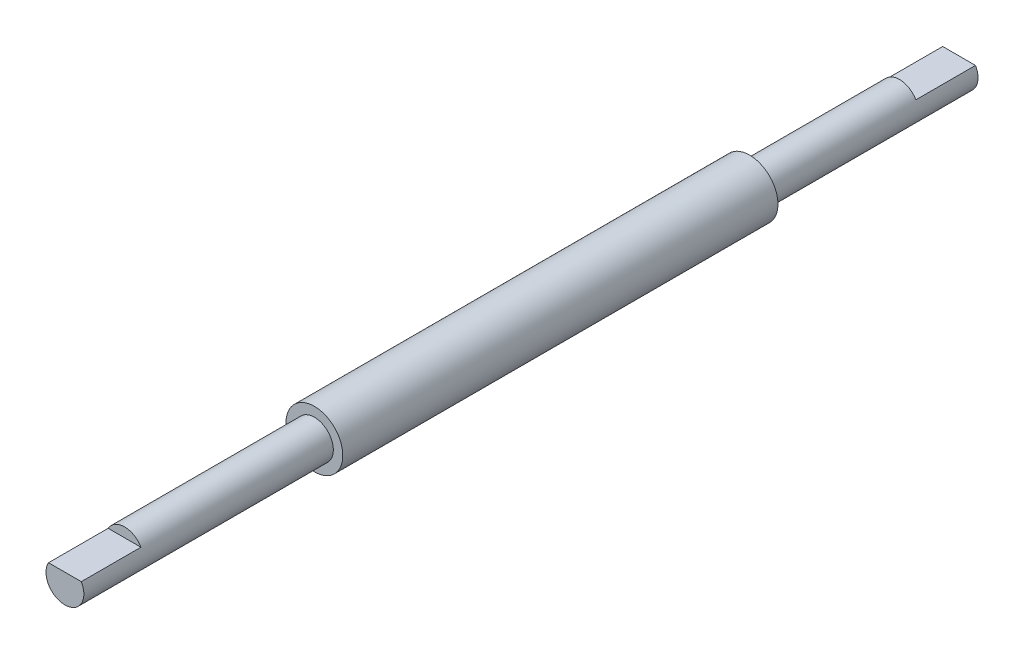
ISO-10303-21;
HEADER;
FILE_DESCRIPTION(('STEP AP214'),'2;1');
FILE_NAME('part.step','',(''),(''),'','','');
FILE_SCHEMA(('AUTOMOTIVE_DESIGN { 1 0 10303 214 1 1 1 1 }'));
ENDSEC;
DATA;
#1=APPLICATION_CONTEXT('core data for automotive mechanical design processes');
#2=APPLICATION_PROTOCOL_DEFINITION('international standard','automotive_design',2000,#1);
#3=PRODUCT_CONTEXT('',#1,'mechanical');
#4=PRODUCT('Part','Part','',(#3));
#5=PRODUCT_RELATED_PRODUCT_CATEGORY('part','',(#4));
#6=PRODUCT_DEFINITION_FORMATION('','',#4);
#7=PRODUCT_DEFINITION_CONTEXT('part definition',#1,'design');
#8=PRODUCT_DEFINITION('design','',#6,#7);
#9=PRODUCT_DEFINITION_SHAPE('','',#8);
#10=(LENGTH_UNIT() NAMED_UNIT(*) SI_UNIT(.MILLI.,.METRE.));
#11=(NAMED_UNIT(*) PLANE_ANGLE_UNIT() SI_UNIT($,.RADIAN.));
#12=(NAMED_UNIT(*) SI_UNIT($,.STERADIAN.) SOLID_ANGLE_UNIT());
#13=UNCERTAINTY_MEASURE_WITH_UNIT(LENGTH_MEASURE(1.E-05),#10,'distance_accuracy_value','');
#14=(GEOMETRIC_REPRESENTATION_CONTEXT(3) GLOBAL_UNCERTAINTY_ASSIGNED_CONTEXT((#13)) GLOBAL_UNIT_ASSIGNED_CONTEXT((#10,
#11,#12)) REPRESENTATION_CONTEXT('',''));
#15=CARTESIAN_POINT('',(0.,0.,0.));
#16=DIRECTION('',(0.,0.,1.));
#17=DIRECTION('',(1.,0.,0.));
#18=AXIS2_PLACEMENT_3D('',#15,#16,#17);
#19=CARTESIAN_POINT('',(0.,0.,300.));
#20=DIRECTION('',(0.,0.,-1.));
#21=DIRECTION('',(-1.,0.,0.));
#22=AXIS2_PLACEMENT_3D('',#19,#20,#21);
#23=CYLINDRICAL_SURFACE('',#22,6.35);
#24=CARTESIAN_POINT('',(0.,0.,216.2975));
#25=DIRECTION('',(0.,0.,-1.));
#26=DIRECTION('',(-1.,0.,0.));
#27=AXIS2_PLACEMENT_3D('',#24,#25,#26);
#28=CIRCLE('',#27,6.35);
#29=CARTESIAN_POINT('',(-6.35,0.,216.2975));
#30=VERTEX_POINT('',#29);
#31=EDGE_CURVE('E11',#30,#30,#28,.T.);
#32=ORIENTED_EDGE('',*,*,#31,.F.);
#33=EDGE_LOOP('',(#32));
#34=FACE_BOUND('',#33,.T.);
#35=DIRECTION('',(0.,0.,1.));
#36=VECTOR('',#35,1.);
#37=CARTESIAN_POINT('',(5.49926131403118,3.175,280.));
#38=LINE('',#37,#36);
#39=CARTESIAN_POINT('',(5.49926131403118,3.175,280.));
#40=VERTEX_POINT('',#39);
#41=CARTESIAN_POINT('',(5.49926131403118,3.175,300.));
#42=VERTEX_POINT('',#41);
#43=EDGE_CURVE('E81',#40,#42,#38,.T.);
#44=ORIENTED_EDGE('',*,*,#43,.T.);
#45=CARTESIAN_POINT('',(0.,0.,300.));
#46=DIRECTION('',(0.,0.,1.));
#47=DIRECTION('',(1.,0.,0.));
#48=AXIS2_PLACEMENT_3D('',#45,#46,#47);
#49=CIRCLE('',#48,6.35);
#50=CARTESIAN_POINT('',(-5.49926131403118,3.175,300.));
#51=VERTEX_POINT('',#50);
#52=EDGE_CURVE('E46',#51,#42,#49,.T.);
#53=ORIENTED_EDGE('',*,*,#52,.F.);
#54=DIRECTION('',(0.,0.,1.));
#55=VECTOR('',#54,1.);
#56=CARTESIAN_POINT('',(-5.49926131403119,3.175,280.));
#57=LINE('',#56,#55);
#58=CARTESIAN_POINT('',(-5.49926131403119,3.175,280.));
#59=VERTEX_POINT('',#58);
#60=EDGE_CURVE('E53',#59,#51,#57,.T.);
#61=ORIENTED_EDGE('',*,*,#60,.F.);
#62=CARTESIAN_POINT('',(0.,0.,280.));
#63=DIRECTION('',(0.,0.,1.));
#64=DIRECTION('',(1.,0.,0.));
#65=AXIS2_PLACEMENT_3D('',#62,#63,#64);
#66=CIRCLE('',#65,6.35);
#67=EDGE_CURVE('E84',#40,#59,#66,.T.);
#68=ORIENTED_EDGE('',*,*,#67,.F.);
#69=EDGE_LOOP('',(#44,#53,#61,#68));
#70=FACE_BOUND('',#69,.T.);
#71=ADVANCED_FACE('F38',(#34,#70),#23,.T.);
#72=CARTESIAN_POINT('',(0.,0.,300.));
#73=DIRECTION('',(0.,0.,1.));
#74=DIRECTION('',(1.,0.,0.));
#75=AXIS2_PLACEMENT_3D('',#72,#73,#74);
#76=PLANE('',#75);
#77=ORIENTED_EDGE('',*,*,#52,.T.);
#78=DIRECTION('',(-1.,0.,0.));
#79=VECTOR('',#78,1.);
#80=CARTESIAN_POINT('',(0.,3.175,300.));
#81=LINE('',#80,#79);
#82=EDGE_CURVE('E88',#42,#51,#81,.T.);
#83=ORIENTED_EDGE('',*,*,#82,.T.);
#84=EDGE_LOOP('',(#77,#83));
#85=FACE_BOUND('',#84,.T.);
#86=ADVANCED_FACE('F143',(#85),#76,.T.);
#87=CARTESIAN_POINT('',(0.,0.,0.));
#88=DIRECTION('',(0.,0.,1.));
#89=DIRECTION('',(1.,0.,0.));
#90=AXIS2_PLACEMENT_3D('',#87,#88,#89);
#91=PLANE('',#90);
#92=DIRECTION('',(1.,0.,0.));
#93=VECTOR('',#92,1.);
#94=CARTESIAN_POINT('',(-5.49926131403118,3.175,0.));
#95=LINE('',#94,#93);
#96=CARTESIAN_POINT('',(-5.49926131403118,3.175,0.));
#97=VERTEX_POINT('',#96);
#98=CARTESIAN_POINT('',(5.49926131403118,3.175,0.));
#99=VERTEX_POINT('',#98);
#100=EDGE_CURVE('E93',#97,#99,#95,.T.);
#101=ORIENTED_EDGE('',*,*,#100,.T.);
#102=CARTESIAN_POINT('',(0.,0.,0.));
#103=DIRECTION('',(0.,0.,1.));
#104=DIRECTION('',(1.,0.,0.));
#105=AXIS2_PLACEMENT_3D('',#102,#103,#104);
#106=CIRCLE('',#105,6.35);
#107=EDGE_CURVE('E115',#97,#99,#106,.T.);
#108=ORIENTED_EDGE('',*,*,#107,.F.);
#109=EDGE_LOOP('',(#101,#108));
#110=FACE_BOUND('',#109,.T.);
#111=ADVANCED_FACE('F140',(#110),#91,.F.);
#112=CARTESIAN_POINT('',(0.,0.,70.2975));
#113=DIRECTION('',(0.,0.,-1.));
#114=DIRECTION('',(-1.,0.,0.));
#115=AXIS2_PLACEMENT_3D('',#112,#113,#114);
#116=CIRCLE('',#115,6.35);
#117=CARTESIAN_POINT('',(-6.35,0.,70.2975));
#118=VERTEX_POINT('',#117);
#119=EDGE_CURVE('E111',#118,#118,#116,.T.);
#120=ORIENTED_EDGE('',*,*,#119,.T.);
#121=EDGE_LOOP('',(#120));
#122=FACE_BOUND('',#121,.T.);
#123=DIRECTION('',(0.,0.,-1.));
#124=VECTOR('',#123,1.);
#125=CARTESIAN_POINT('',(5.49926131403118,3.175,20.));
#126=LINE('',#125,#124);
#127=CARTESIAN_POINT('',(5.49926131403118,3.175,20.));
#128=VERTEX_POINT('',#127);
#129=EDGE_CURVE('E102',#128,#99,#126,.T.);
#130=ORIENTED_EDGE('',*,*,#129,.F.);
#131=CARTESIAN_POINT('',(0.,0.,20.));
#132=DIRECTION('',(0.,0.,1.));
#133=DIRECTION('',(1.,0.,0.));
#134=AXIS2_PLACEMENT_3D('',#131,#132,#133);
#135=CIRCLE('',#134,6.35);
#136=CARTESIAN_POINT('',(-5.49926131403118,3.175,20.));
#137=VERTEX_POINT('',#136);
#138=EDGE_CURVE('E97',#128,#137,#135,.T.);
#139=ORIENTED_EDGE('',*,*,#138,.T.);
#140=DIRECTION('',(0.,0.,-1.));
#141=VECTOR('',#140,1.);
#142=CARTESIAN_POINT('',(-5.49926131403118,3.175,20.));
#143=LINE('',#142,#141);
#144=EDGE_CURVE('E61',#137,#97,#143,.T.);
#145=ORIENTED_EDGE('',*,*,#144,.T.);
#146=ORIENTED_EDGE('',*,*,#107,.T.);
#147=EDGE_LOOP('',(#130,#139,#145,#146));
#148=FACE_BOUND('',#147,.T.);
#149=ADVANCED_FACE('F40',(#122,#148),#23,.T.);
#150=CARTESIAN_POINT('',(0.,0.,216.2975));
#151=DIRECTION('',(0.,0.,-1.));
#152=DIRECTION('',(-1.,0.,0.));
#153=AXIS2_PLACEMENT_3D('',#150,#151,#152);
#154=CYLINDRICAL_SURFACE('',#153,9.525);
#155=CARTESIAN_POINT('',(0.,0.,216.2975));
#156=DIRECTION('',(0.,0.,-1.));
#157=DIRECTION('',(-1.,0.,0.));
#158=AXIS2_PLACEMENT_3D('',#155,#156,#157);
#159=CIRCLE('',#158,9.525);
#160=CARTESIAN_POINT('',(-9.525,0.,216.2975));
#161=VERTEX_POINT('',#160);
#162=EDGE_CURVE('E108',#161,#161,#159,.T.);
#163=ORIENTED_EDGE('',*,*,#162,.T.);
#164=EDGE_LOOP('',(#163));
#165=FACE_BOUND('',#164,.T.);
#166=CARTESIAN_POINT('',(0.,0.,70.2975));
#167=DIRECTION('',(0.,0.,-1.));
#168=DIRECTION('',(-1.,0.,0.));
#169=AXIS2_PLACEMENT_3D('',#166,#167,#168);
#170=CIRCLE('',#169,9.525);
#171=CARTESIAN_POINT('',(-9.525,0.,70.2975));
#172=VERTEX_POINT('',#171);
#173=EDGE_CURVE('E107',#172,#172,#170,.T.);
#174=ORIENTED_EDGE('',*,*,#173,.F.);
#175=EDGE_LOOP('',(#174));
#176=FACE_BOUND('',#175,.T.);
#177=ADVANCED_FACE('F130',(#165,#176),#154,.T.);
#178=CARTESIAN_POINT('',(0.,0.,216.2975));
#179=DIRECTION('',(0.,0.,-1.));
#180=DIRECTION('',(-1.,0.,0.));
#181=AXIS2_PLACEMENT_3D('',#178,#179,#180);
#182=PLANE('',#181);
#183=ORIENTED_EDGE('',*,*,#31,.T.);
#184=EDGE_LOOP('',(#183));
#185=FACE_BOUND('',#184,.T.);
#186=ORIENTED_EDGE('',*,*,#162,.F.);
#187=EDGE_LOOP('',(#186));
#188=FACE_BOUND('',#187,.T.);
#189=ADVANCED_FACE('F126',(#185,#188),#182,.F.);
#190=CARTESIAN_POINT('',(0.,0.,70.2975));
#191=DIRECTION('',(0.,0.,-1.));
#192=DIRECTION('',(-1.,0.,0.));
#193=AXIS2_PLACEMENT_3D('',#190,#191,#192);
#194=PLANE('',#193);
#195=ORIENTED_EDGE('',*,*,#119,.F.);
#196=EDGE_LOOP('',(#195));
#197=FACE_BOUND('',#196,.T.);
#198=ORIENTED_EDGE('',*,*,#173,.T.);
#199=EDGE_LOOP('',(#198));
#200=FACE_BOUND('',#199,.T.);
#201=ADVANCED_FACE('F122',(#197,#200),#194,.T.);
#202=CARTESIAN_POINT('',(-5.49926131403118,3.175,20.));
#203=DIRECTION('',(0.,1.,0.));
#204=DIRECTION('',(0.,0.,1.));
#205=AXIS2_PLACEMENT_3D('',#202,#203,#204);
#206=PLANE('',#205);
#207=ORIENTED_EDGE('',*,*,#100,.F.);
#208=ORIENTED_EDGE('',*,*,#144,.F.);
#209=DIRECTION('',(1.,0.,0.));
#210=VECTOR('',#209,1.);
#211=CARTESIAN_POINT('',(-5.49926131403118,3.175,20.));
#212=LINE('',#211,#210);
#213=EDGE_CURVE('E100',#137,#128,#212,.T.);
#214=ORIENTED_EDGE('',*,*,#213,.T.);
#215=ORIENTED_EDGE('',*,*,#129,.T.);
#216=EDGE_LOOP('',(#207,#208,#214,#215));
#217=FACE_BOUND('',#216,.T.);
#218=ADVANCED_FACE('F125',(#217),#206,.T.);
#219=CARTESIAN_POINT('',(0.,0.,20.));
#220=DIRECTION('',(0.,0.,1.));
#221=DIRECTION('',(1.,0.,0.));
#222=AXIS2_PLACEMENT_3D('',#219,#220,#221);
#223=PLANE('',#222);
#224=ORIENTED_EDGE('',*,*,#138,.F.);
#225=ORIENTED_EDGE('',*,*,#213,.F.);
#226=EDGE_LOOP('',(#224,#225));
#227=FACE_BOUND('',#226,.T.);
#228=ADVANCED_FACE('F164',(#227),#223,.F.);
#229=CARTESIAN_POINT('',(0.,3.175,280.));
#230=DIRECTION('',(0.,1.,0.));
#231=DIRECTION('',(0.,0.,1.));
#232=AXIS2_PLACEMENT_3D('',#229,#230,#231);
#233=PLANE('',#232);
#234=ORIENTED_EDGE('',*,*,#82,.F.);
#235=ORIENTED_EDGE('',*,*,#43,.F.);
#236=DIRECTION('',(-1.,0.,0.));
#237=VECTOR('',#236,1.);
#238=CARTESIAN_POINT('',(0.,3.175,280.));
#239=LINE('',#238,#237);
#240=EDGE_CURVE('E77',#40,#59,#239,.T.);
#241=ORIENTED_EDGE('',*,*,#240,.T.);
#242=ORIENTED_EDGE('',*,*,#60,.T.);
#243=EDGE_LOOP('',(#234,#235,#241,#242));
#244=FACE_BOUND('',#243,.T.);
#245=ADVANCED_FACE('F79',(#244),#233,.T.);
#246=CARTESIAN_POINT('',(0.,0.,280.));
#247=DIRECTION('',(0.,0.,1.));
#248=DIRECTION('',(1.,0.,0.));
#249=AXIS2_PLACEMENT_3D('',#246,#247,#248);
#250=PLANE('',#249);
#251=ORIENTED_EDGE('',*,*,#67,.T.);
#252=ORIENTED_EDGE('',*,*,#240,.F.);
#253=EDGE_LOOP('',(#251,#252));
#254=FACE_BOUND('',#253,.T.);
#255=ADVANCED_FACE('F86',(#254),#250,.T.);
#256=CLOSED_SHELL('',(#71,#86,#111,#149,#177,#189,#201,#218,#228,#245,#255));
#257=MANIFOLD_SOLID_BREP('B2',#256);
#258=ADVANCED_BREP_SHAPE_REPRESENTATION('',(#18,#257),#14);
#259=SHAPE_DEFINITION_REPRESENTATION(#9,#258);
ENDSEC;
END-ISO-10303-21;
